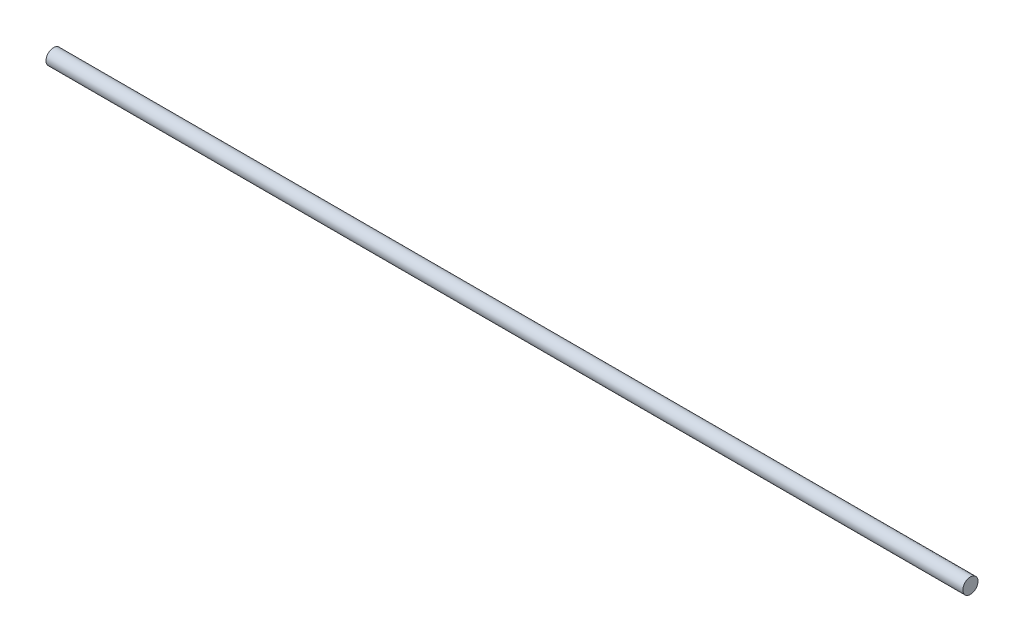
ISO-10303-21;
HEADER;
FILE_DESCRIPTION(('STEP AP214'),'2;1');
FILE_NAME('part.step','',(''),(''),'','','');
FILE_SCHEMA(('AUTOMOTIVE_DESIGN { 1 0 10303 214 1 1 1 1 }'));
ENDSEC;
DATA;
#1=APPLICATION_CONTEXT('core data for automotive mechanical design processes');
#2=APPLICATION_PROTOCOL_DEFINITION('international standard','automotive_design',2000,#1);
#3=PRODUCT_CONTEXT('',#1,'mechanical');
#4=PRODUCT('Part','Part','',(#3));
#5=PRODUCT_RELATED_PRODUCT_CATEGORY('part','',(#4));
#6=PRODUCT_DEFINITION_FORMATION('','',#4);
#7=PRODUCT_DEFINITION_CONTEXT('part definition',#1,'design');
#8=PRODUCT_DEFINITION('design','',#6,#7);
#9=PRODUCT_DEFINITION_SHAPE('','',#8);
#10=(LENGTH_UNIT() NAMED_UNIT(*) SI_UNIT(.MILLI.,.METRE.));
#11=(NAMED_UNIT(*) PLANE_ANGLE_UNIT() SI_UNIT($,.RADIAN.));
#12=(NAMED_UNIT(*) SI_UNIT($,.STERADIAN.) SOLID_ANGLE_UNIT());
#13=UNCERTAINTY_MEASURE_WITH_UNIT(LENGTH_MEASURE(1.E-05),#10,'distance_accuracy_value','');
#14=(GEOMETRIC_REPRESENTATION_CONTEXT(3) GLOBAL_UNCERTAINTY_ASSIGNED_CONTEXT((#13)) GLOBAL_UNIT_ASSIGNED_CONTEXT((#10,
#11,#12)) REPRESENTATION_CONTEXT('',''));
#15=CARTESIAN_POINT('',(0.,0.,0.));
#16=DIRECTION('',(0.,0.,1.));
#17=DIRECTION('',(1.,0.,0.));
#18=AXIS2_PLACEMENT_3D('',#15,#16,#17);
#19=CARTESIAN_POINT('',(241.185,0.,0.));
#20=DIRECTION('',(-1.,0.,0.));
#21=DIRECTION('',(0.,0.,1.));
#22=AXIS2_PLACEMENT_3D('',#19,#20,#21);
#23=CYLINDRICAL_SURFACE('',#22,4.);
#24=CARTESIAN_POINT('',(241.185,0.,0.));
#25=DIRECTION('',(1.,0.,0.));
#26=DIRECTION('',(0.,0.,-1.));
#27=AXIS2_PLACEMENT_3D('',#24,#25,#26);
#28=CIRCLE('',#27,4.);
#29=CARTESIAN_POINT('',(241.185,0.,-4.));
#30=VERTEX_POINT('',#29);
#31=EDGE_CURVE('E10',#30,#30,#28,.T.);
#32=ORIENTED_EDGE('',*,*,#31,.F.);
#33=EDGE_LOOP('',(#32));
#34=FACE_BOUND('',#33,.T.);
#35=CARTESIAN_POINT('',(-241.185,0.,0.));
#36=DIRECTION('',(1.,0.,0.));
#37=DIRECTION('',(0.,0.,-1.));
#38=AXIS2_PLACEMENT_3D('',#35,#36,#37);
#39=CIRCLE('',#38,4.);
#40=CARTESIAN_POINT('',(-241.185,0.,-4.));
#41=VERTEX_POINT('',#40);
#42=EDGE_CURVE('E46',#41,#41,#39,.T.);
#43=ORIENTED_EDGE('',*,*,#42,.T.);
#44=EDGE_LOOP('',(#43));
#45=FACE_BOUND('',#44,.T.);
#46=ADVANCED_FACE('F43',(#34,#45),#23,.T.);
#47=CARTESIAN_POINT('',(241.185,0.,0.));
#48=DIRECTION('',(1.,0.,0.));
#49=DIRECTION('',(0.,0.,-1.));
#50=AXIS2_PLACEMENT_3D('',#47,#48,#49);
#51=PLANE('',#50);
#52=ORIENTED_EDGE('',*,*,#31,.T.);
#53=EDGE_LOOP('',(#52));
#54=FACE_BOUND('',#53,.T.);
#55=ADVANCED_FACE('F60',(#54),#51,.T.);
#56=CARTESIAN_POINT('',(-241.185,0.,0.));
#57=DIRECTION('',(1.,0.,0.));
#58=DIRECTION('',(0.,0.,-1.));
#59=AXIS2_PLACEMENT_3D('',#56,#57,#58);
#60=PLANE('',#59);
#61=ORIENTED_EDGE('',*,*,#42,.F.);
#62=EDGE_LOOP('',(#61));
#63=FACE_BOUND('',#62,.T.);
#64=ADVANCED_FACE('F58',(#63),#60,.F.);
#65=CLOSED_SHELL('',(#46,#55,#64));
#66=MANIFOLD_SOLID_BREP('B2',#65);
#67=ADVANCED_BREP_SHAPE_REPRESENTATION('',(#18,#66),#14);
#68=SHAPE_DEFINITION_REPRESENTATION(#9,#67);
ENDSEC;
END-ISO-10303-21;
